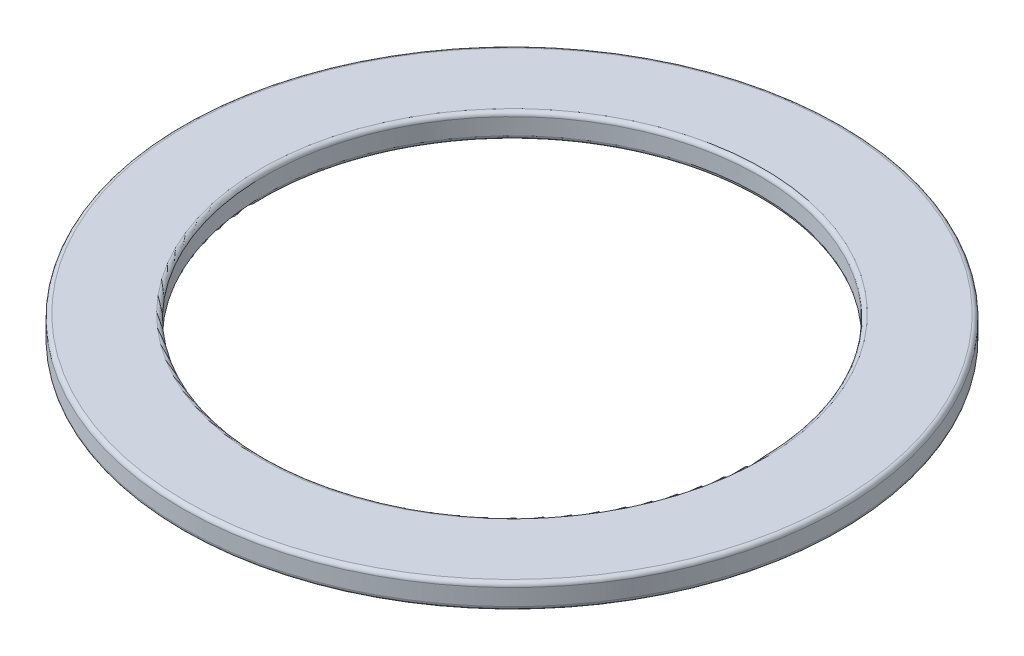
ISO-10303-21;
HEADER;
FILE_DESCRIPTION(('STEP AP214'),'2;1');
FILE_NAME('part.step','',(''),(''),'','','');
FILE_SCHEMA(('AUTOMOTIVE_DESIGN { 1 0 10303 214 1 1 1 1 }'));
ENDSEC;
DATA;
#1=APPLICATION_CONTEXT('core data for automotive mechanical design processes');
#2=APPLICATION_PROTOCOL_DEFINITION('international standard','automotive_design',2000,#1);
#3=PRODUCT_CONTEXT('',#1,'mechanical');
#4=PRODUCT('Part','Part','',(#3));
#5=PRODUCT_RELATED_PRODUCT_CATEGORY('part','',(#4));
#6=PRODUCT_DEFINITION_FORMATION('','',#4);
#7=PRODUCT_DEFINITION_CONTEXT('part definition',#1,'design');
#8=PRODUCT_DEFINITION('design','',#6,#7);
#9=PRODUCT_DEFINITION_SHAPE('','',#8);
#10=(LENGTH_UNIT() NAMED_UNIT(*) SI_UNIT(.MILLI.,.METRE.));
#11=(NAMED_UNIT(*) PLANE_ANGLE_UNIT() SI_UNIT($,.RADIAN.));
#12=(NAMED_UNIT(*) SI_UNIT($,.STERADIAN.) SOLID_ANGLE_UNIT());
#13=UNCERTAINTY_MEASURE_WITH_UNIT(LENGTH_MEASURE(1.E-05),#10,'distance_accuracy_value','');
#14=(GEOMETRIC_REPRESENTATION_CONTEXT(3) GLOBAL_UNCERTAINTY_ASSIGNED_CONTEXT((#13)) GLOBAL_UNIT_ASSIGNED_CONTEXT((#10,
#11,#12)) REPRESENTATION_CONTEXT('',''));
#15=CARTESIAN_POINT('',(0.,0.,0.));
#16=DIRECTION('',(0.,0.,1.));
#17=DIRECTION('',(1.,0.,0.));
#18=AXIS2_PLACEMENT_3D('',#15,#16,#17);
#19=CARTESIAN_POINT('',(0.,0.3,0.));
#20=DIRECTION('',(0.,1.,0.));
#21=DIRECTION('',(0.,0.,1.));
#22=AXIS2_PLACEMENT_3D('',#19,#20,#21);
#23=PLANE('',#22);
#24=CARTESIAN_POINT('',(0.,0.3,0.));
#25=DIRECTION('',(0.,1.,0.));
#26=DIRECTION('',(0.,0.,1.));
#27=AXIS2_PLACEMENT_3D('',#24,#25,#26);
#28=CIRCLE('',#27,3.05);
#29=CARTESIAN_POINT('',(0.,0.3,3.05));
#30=VERTEX_POINT('',#29);
#31=EDGE_CURVE('E50',#30,#30,#28,.F.);
#32=ORIENTED_EDGE('',*,*,#31,.T.);
#33=EDGE_LOOP('',(#32));
#34=FACE_BOUND('',#33,.T.);
#35=CARTESIAN_POINT('',(0.,0.3,0.));
#36=DIRECTION('',(0.,1.,0.));
#37=DIRECTION('',(0.,0.,1.));
#38=AXIS2_PLACEMENT_3D('',#35,#36,#37);
#39=CIRCLE('',#38,3.95);
#40=CARTESIAN_POINT('',(0.,0.3,3.95));
#41=VERTEX_POINT('',#40);
#42=EDGE_CURVE('E55',#41,#41,#39,.T.);
#43=ORIENTED_EDGE('',*,*,#42,.T.);
#44=EDGE_LOOP('',(#43));
#45=FACE_BOUND('',#44,.T.);
#46=ADVANCED_FACE('F37',(#34,#45),#23,.T.);
#47=CARTESIAN_POINT('',(0.,0.,0.));
#48=DIRECTION('',(0.,1.,0.));
#49=DIRECTION('',(0.,0.,1.));
#50=AXIS2_PLACEMENT_3D('',#47,#48,#49);
#51=PLANE('',#50);
#52=CARTESIAN_POINT('',(0.,0.,0.));
#53=DIRECTION('',(0.,1.,0.));
#54=DIRECTION('',(0.,0.,1.));
#55=AXIS2_PLACEMENT_3D('',#52,#53,#54);
#56=CIRCLE('',#55,3.05);
#57=CARTESIAN_POINT('',(0.,0.,3.05));
#58=VERTEX_POINT('',#57);
#59=EDGE_CURVE('E69',#58,#58,#56,.T.);
#60=ORIENTED_EDGE('',*,*,#59,.T.);
#61=EDGE_LOOP('',(#60));
#62=FACE_BOUND('',#61,.T.);
#63=CARTESIAN_POINT('',(0.,0.,0.));
#64=DIRECTION('',(0.,1.,0.));
#65=DIRECTION('',(0.,0.,1.));
#66=AXIS2_PLACEMENT_3D('',#63,#64,#65);
#67=CIRCLE('',#66,3.95);
#68=CARTESIAN_POINT('',(0.,0.,3.95));
#69=VERTEX_POINT('',#68);
#70=EDGE_CURVE('E73',#69,#69,#67,.F.);
#71=ORIENTED_EDGE('',*,*,#70,.T.);
#72=EDGE_LOOP('',(#71));
#73=FACE_BOUND('',#72,.T.);
#74=ADVANCED_FACE('F78',(#62,#73),#51,.F.);
#75=CARTESIAN_POINT('',(0.,0.3,0.));
#76=DIRECTION('',(0.,-1.,0.));
#77=DIRECTION('',(0.,0.,-1.));
#78=AXIS2_PLACEMENT_3D('',#75,#76,#77);
#79=CYLINDRICAL_SURFACE('',#78,4.);
#80=CARTESIAN_POINT('',(0.,0.05,0.));
#81=DIRECTION('',(0.,1.,0.));
#82=DIRECTION('',(0.,0.,1.));
#83=AXIS2_PLACEMENT_3D('',#80,#81,#82);
#84=CIRCLE('',#83,4.);
#85=CARTESIAN_POINT('',(0.,0.05,4.));
#86=VERTEX_POINT('',#85);
#87=EDGE_CURVE('E10',#86,#86,#84,.T.);
#88=ORIENTED_EDGE('',*,*,#87,.T.);
#89=EDGE_LOOP('',(#88));
#90=FACE_BOUND('',#89,.T.);
#91=CARTESIAN_POINT('',(0.,0.25,0.));
#92=DIRECTION('',(0.,1.,0.));
#93=DIRECTION('',(0.,0.,1.));
#94=AXIS2_PLACEMENT_3D('',#91,#92,#93);
#95=CIRCLE('',#94,4.);
#96=CARTESIAN_POINT('',(0.,0.25,4.));
#97=VERTEX_POINT('',#96);
#98=EDGE_CURVE('E45',#97,#97,#95,.F.);
#99=ORIENTED_EDGE('',*,*,#98,.T.);
#100=EDGE_LOOP('',(#99));
#101=FACE_BOUND('',#100,.T.);
#102=ADVANCED_FACE('F98',(#90,#101),#79,.T.);
#103=CARTESIAN_POINT('',(0.,0.3,0.));
#104=DIRECTION('',(0.,-1.,0.));
#105=DIRECTION('',(0.,0.,-1.));
#106=AXIS2_PLACEMENT_3D('',#103,#104,#105);
#107=CYLINDRICAL_SURFACE('',#106,3.);
#108=CARTESIAN_POINT('',(0.,0.05,0.));
#109=DIRECTION('',(0.,1.,0.));
#110=DIRECTION('',(0.,0.,1.));
#111=AXIS2_PLACEMENT_3D('',#108,#109,#110);
#112=CIRCLE('',#111,3.);
#113=CARTESIAN_POINT('',(0.,0.05,3.));
#114=VERTEX_POINT('',#113);
#115=EDGE_CURVE('E61',#114,#114,#112,.F.);
#116=ORIENTED_EDGE('',*,*,#115,.T.);
#117=EDGE_LOOP('',(#116));
#118=FACE_BOUND('',#117,.T.);
#119=CARTESIAN_POINT('',(0.,0.25,0.));
#120=DIRECTION('',(0.,1.,0.));
#121=DIRECTION('',(0.,0.,1.));
#122=AXIS2_PLACEMENT_3D('',#119,#120,#121);
#123=CIRCLE('',#122,3.);
#124=CARTESIAN_POINT('',(0.,0.25,3.));
#125=VERTEX_POINT('',#124);
#126=EDGE_CURVE('E65',#125,#125,#123,.T.);
#127=ORIENTED_EDGE('',*,*,#126,.T.);
#128=EDGE_LOOP('',(#127));
#129=FACE_BOUND('',#128,.T.);
#130=ADVANCED_FACE('F103',(#118,#129),#107,.F.);
#131=CARTESIAN_POINT('',(0.,0.05,0.));
#132=DIRECTION('',(0.,1.,0.));
#133=DIRECTION('',(0.,0.,1.));
#134=AXIS2_PLACEMENT_3D('',#131,#132,#133);
#135=TOROIDAL_SURFACE('',#134,3.05,0.05);
#136=ORIENTED_EDGE('',*,*,#115,.F.);
#137=EDGE_LOOP('',(#136));
#138=FACE_BOUND('',#137,.T.);
#139=ORIENTED_EDGE('',*,*,#59,.F.);
#140=EDGE_LOOP('',(#139));
#141=FACE_BOUND('',#140,.T.);
#142=ADVANCED_FACE('F89',(#138,#141),#135,.T.);
#143=CARTESIAN_POINT('',(0.,0.25,0.));
#144=DIRECTION('',(0.,1.,0.));
#145=DIRECTION('',(0.,0.,1.));
#146=AXIS2_PLACEMENT_3D('',#143,#144,#145);
#147=TOROIDAL_SURFACE('',#146,3.05,0.05);
#148=ORIENTED_EDGE('',*,*,#31,.F.);
#149=EDGE_LOOP('',(#148));
#150=FACE_BOUND('',#149,.T.);
#151=ORIENTED_EDGE('',*,*,#126,.F.);
#152=EDGE_LOOP('',(#151));
#153=FACE_BOUND('',#152,.T.);
#154=ADVANCED_FACE('F83',(#150,#153),#147,.T.);
#155=CARTESIAN_POINT('',(0.,0.05,0.));
#156=DIRECTION('',(0.,1.,0.));
#157=DIRECTION('',(0.,0.,1.));
#158=AXIS2_PLACEMENT_3D('',#155,#156,#157);
#159=TOROIDAL_SURFACE('',#158,3.95,0.05);
#160=ORIENTED_EDGE('',*,*,#70,.F.);
#161=EDGE_LOOP('',(#160));
#162=FACE_BOUND('',#161,.T.);
#163=ORIENTED_EDGE('',*,*,#87,.F.);
#164=EDGE_LOOP('',(#163));
#165=FACE_BOUND('',#164,.T.);
#166=ADVANCED_FACE('F80',(#162,#165),#159,.T.);
#167=CARTESIAN_POINT('',(0.,0.25,0.));
#168=DIRECTION('',(0.,1.,0.));
#169=DIRECTION('',(0.,0.,1.));
#170=AXIS2_PLACEMENT_3D('',#167,#168,#169);
#171=TOROIDAL_SURFACE('',#170,3.95,0.05);
#172=ORIENTED_EDGE('',*,*,#98,.F.);
#173=EDGE_LOOP('',(#172));
#174=FACE_BOUND('',#173,.T.);
#175=ORIENTED_EDGE('',*,*,#42,.F.);
#176=EDGE_LOOP('',(#175));
#177=FACE_BOUND('',#176,.T.);
#178=ADVANCED_FACE('F39',(#174,#177),#171,.T.);
#179=CLOSED_SHELL('',(#46,#74,#102,#130,#142,#154,#166,#178));
#180=MANIFOLD_SOLID_BREP('B2',#179);
#181=ADVANCED_BREP_SHAPE_REPRESENTATION('',(#18,#180),#14);
#182=SHAPE_DEFINITION_REPRESENTATION(#9,#181);
ENDSEC;
END-ISO-10303-21;
